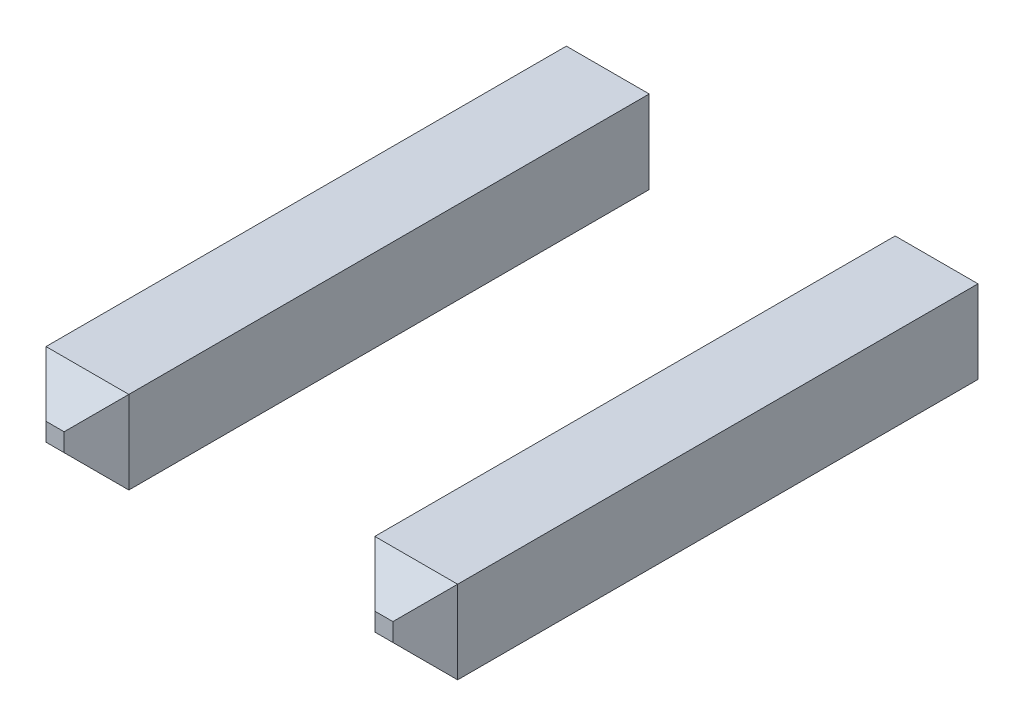
ISO-10303-21;
HEADER;
FILE_DESCRIPTION(('STEP AP214'),'2;1');
FILE_NAME('part.step','',(''),(''),'','','');
FILE_SCHEMA(('AUTOMOTIVE_DESIGN { 1 0 10303 214 1 1 1 1 }'));
ENDSEC;
DATA;
#1=APPLICATION_CONTEXT('core data for automotive mechanical design processes');
#2=APPLICATION_PROTOCOL_DEFINITION('international standard','automotive_design',2000,#1);
#3=PRODUCT_CONTEXT('',#1,'mechanical');
#4=PRODUCT('Part','Part','',(#3));
#5=PRODUCT_RELATED_PRODUCT_CATEGORY('part','',(#4));
#6=PRODUCT_DEFINITION_FORMATION('','',#4);
#7=PRODUCT_DEFINITION_CONTEXT('part definition',#1,'design');
#8=PRODUCT_DEFINITION('design','',#6,#7);
#9=PRODUCT_DEFINITION_SHAPE('','',#8);
#10=(LENGTH_UNIT() NAMED_UNIT(*) SI_UNIT(.MILLI.,.METRE.));
#11=(NAMED_UNIT(*) PLANE_ANGLE_UNIT() SI_UNIT($,.RADIAN.));
#12=(NAMED_UNIT(*) SI_UNIT($,.STERADIAN.) SOLID_ANGLE_UNIT());
#13=UNCERTAINTY_MEASURE_WITH_UNIT(LENGTH_MEASURE(1.E-05),#10,'distance_accuracy_value','');
#14=(GEOMETRIC_REPRESENTATION_CONTEXT(3) GLOBAL_UNCERTAINTY_ASSIGNED_CONTEXT((#13)) GLOBAL_UNIT_ASSIGNED_CONTEXT((#10,
#11,#12)) REPRESENTATION_CONTEXT('',''));
#15=CARTESIAN_POINT('',(0.,0.,0.));
#16=DIRECTION('',(0.,0.,1.));
#17=DIRECTION('',(1.,0.,0.));
#18=AXIS2_PLACEMENT_3D('',#15,#16,#17);
#19=CARTESIAN_POINT('',(0.32,0.32,-3.683));
#20=DIRECTION('',(1.,0.,0.));
#21=DIRECTION('',(0.,1.,0.));
#22=AXIS2_PLACEMENT_3D('',#19,#20,#21);
#23=PLANE('',#22);
#24=DIRECTION('',(0.,-1.,0.));
#25=VECTOR('',#24,1.);
#26=CARTESIAN_POINT('',(0.32,0.32,4.239));
#27=LINE('',#26,#25);
#28=CARTESIAN_POINT('',(0.32,0.32,4.239));
#29=VERTEX_POINT('',#28);
#30=CARTESIAN_POINT('',(0.32,-0.32,4.239));
#31=VERTEX_POINT('',#30);
#32=EDGE_CURVE('P0_E41',#29,#31,#27,.T.);
#33=ORIENTED_EDGE('',*,*,#32,.F.);
#34=DIRECTION('',(0.,0.,1.));
#35=VECTOR('',#34,1.);
#36=CARTESIAN_POINT('',(0.32,0.32,-3.683));
#37=LINE('',#36,#35);
#38=CARTESIAN_POINT('',(0.32,0.32,8.259));
#39=VERTEX_POINT('',#38);
#40=EDGE_CURVE('P0_E11',#29,#39,#37,.T.);
#41=ORIENTED_EDGE('',*,*,#40,.T.);
#42=DIRECTION('',(0.,-1.,0.));
#43=VECTOR('',#42,1.);
#44=CARTESIAN_POINT('',(0.32,0.32,8.259));
#45=LINE('',#44,#43);
#46=CARTESIAN_POINT('',(0.32,-0.32,8.259));
#47=VERTEX_POINT('',#46);
#48=EDGE_CURVE('P0_E27',#39,#47,#45,.T.);
#49=ORIENTED_EDGE('',*,*,#48,.T.);
#50=DIRECTION('',(0.,0.,1.));
#51=VECTOR('',#50,1.);
#52=CARTESIAN_POINT('',(0.32,-0.32,-3.683));
#53=LINE('',#52,#51);
#54=EDGE_CURVE('P0_E111',#31,#47,#53,.T.);
#55=ORIENTED_EDGE('',*,*,#54,.F.);
#56=EDGE_LOOP('',(#33,#41,#49,#55));
#57=FACE_BOUND('',#56,.T.);
#58=ADVANCED_FACE('P0_F16',(#57),#23,.T.);
#59=CARTESIAN_POINT('',(-0.32,-0.32,-3.683));
#60=DIRECTION('',(0.,-1.,0.));
#61=DIRECTION('',(0.,0.,-1.));
#62=AXIS2_PLACEMENT_3D('',#59,#60,#61);
#63=PLANE('',#62);
#64=DIRECTION('',(-1.,0.,0.));
#65=VECTOR('',#64,1.);
#66=CARTESIAN_POINT('',(-0.933161319874351,-0.32,4.239));
#67=LINE('',#66,#65);
#68=CARTESIAN_POINT('',(-0.32,-0.32,4.239));
#69=VERTEX_POINT('',#68);
#70=EDGE_CURVE('P0_E77',#31,#69,#67,.T.);
#71=ORIENTED_EDGE('',*,*,#70,.F.);
#72=ORIENTED_EDGE('',*,*,#54,.T.);
#73=DIRECTION('',(-1.,0.,0.));
#74=VECTOR('',#73,1.);
#75=CARTESIAN_POINT('',(-0.32,-0.32,8.259));
#76=LINE('',#75,#74);
#77=CARTESIAN_POINT('',(-0.32,-0.32,8.259));
#78=VERTEX_POINT('',#77);
#79=EDGE_CURVE('P0_E91',#47,#78,#76,.T.);
#80=ORIENTED_EDGE('',*,*,#79,.T.);
#81=DIRECTION('',(0.,0.,1.));
#82=VECTOR('',#81,1.);
#83=CARTESIAN_POINT('',(-0.32,-0.32,-3.683));
#84=LINE('',#83,#82);
#85=EDGE_CURVE('P0_E90',#69,#78,#84,.T.);
#86=ORIENTED_EDGE('',*,*,#85,.F.);
#87=EDGE_LOOP('',(#71,#72,#80,#86));
#88=FACE_BOUND('',#87,.T.);
#89=ADVANCED_FACE('P0_F18',(#88),#63,.T.);
#90=CARTESIAN_POINT('',(-0.32,0.32,-3.683));
#91=DIRECTION('',(-1.,0.,0.));
#92=DIRECTION('',(0.,0.,1.));
#93=AXIS2_PLACEMENT_3D('',#90,#91,#92);
#94=PLANE('',#93);
#95=DIRECTION('',(0.,1.,0.));
#96=VECTOR('',#95,1.);
#97=CARTESIAN_POINT('',(-0.32,0.32,4.239));
#98=LINE('',#97,#96);
#99=CARTESIAN_POINT('',(-0.32,0.32,4.239));
#100=VERTEX_POINT('',#99);
#101=EDGE_CURVE('P0_E82',#69,#100,#98,.T.);
#102=ORIENTED_EDGE('',*,*,#101,.F.);
#103=ORIENTED_EDGE('',*,*,#85,.T.);
#104=DIRECTION('',(0.,1.,0.));
#105=VECTOR('',#104,1.);
#106=CARTESIAN_POINT('',(-0.32,0.32,8.259));
#107=LINE('',#106,#105);
#108=CARTESIAN_POINT('',(-0.32,0.32,8.259));
#109=VERTEX_POINT('',#108);
#110=EDGE_CURVE('P0_E96',#78,#109,#107,.T.);
#111=ORIENTED_EDGE('',*,*,#110,.T.);
#112=DIRECTION('',(0.,0.,1.));
#113=VECTOR('',#112,1.);
#114=CARTESIAN_POINT('',(-0.32,0.32,-3.683));
#115=LINE('',#114,#113);
#116=EDGE_CURVE('P0_E100',#100,#109,#115,.T.);
#117=ORIENTED_EDGE('',*,*,#116,.F.);
#118=EDGE_LOOP('',(#102,#103,#111,#117));
#119=FACE_BOUND('',#118,.T.);
#120=ADVANCED_FACE('P0_F98',(#119),#94,.T.);
#121=CARTESIAN_POINT('',(-0.32,0.32,-3.683));
#122=DIRECTION('',(0.,1.,0.));
#123=DIRECTION('',(1.,0.,0.));
#124=AXIS2_PLACEMENT_3D('',#121,#122,#123);
#125=PLANE('',#124);
#126=DIRECTION('',(-1.,0.,0.));
#127=VECTOR('',#126,1.);
#128=CARTESIAN_POINT('',(-0.933161319874351,0.32,4.239));
#129=LINE('',#128,#127);
#130=EDGE_CURVE('P0_E133',#29,#100,#129,.T.);
#131=ORIENTED_EDGE('',*,*,#130,.T.);
#132=ORIENTED_EDGE('',*,*,#116,.T.);
#133=DIRECTION('',(1.,0.,0.));
#134=VECTOR('',#133,1.);
#135=CARTESIAN_POINT('',(-0.32,0.32,8.259));
#136=LINE('',#135,#134);
#137=EDGE_CURVE('P0_E132',#109,#39,#136,.T.);
#138=ORIENTED_EDGE('',*,*,#137,.T.);
#139=ORIENTED_EDGE('',*,*,#40,.F.);
#140=EDGE_LOOP('',(#131,#132,#138,#139));
#141=FACE_BOUND('',#140,.T.);
#142=ADVANCED_FACE('P0_F235',(#141),#125,.T.);
#143=CARTESIAN_POINT('',(0.,0.,8.509));
#144=DIRECTION('',(0.,0.,1.));
#145=DIRECTION('',(1.,0.,0.));
#146=AXIS2_PLACEMENT_3D('',#143,#144,#145);
#147=PLANE('',#146);
#148=DIRECTION('',(0.,-1.,0.));
#149=VECTOR('',#148,1.);
#150=CARTESIAN_POINT('',(-0.07,0.,8.509));
#151=LINE('',#150,#149);
#152=CARTESIAN_POINT('',(-0.07,0.07,8.509));
#153=VERTEX_POINT('',#152);
#154=CARTESIAN_POINT('',(-0.07,-0.07,8.509));
#155=VERTEX_POINT('',#154);
#156=EDGE_CURVE('P0_E128',#153,#155,#151,.T.);
#157=ORIENTED_EDGE('',*,*,#156,.T.);
#158=DIRECTION('',(1.,0.,0.));
#159=VECTOR('',#158,1.);
#160=CARTESIAN_POINT('',(0.,-0.07,8.509));
#161=LINE('',#160,#159);
#162=CARTESIAN_POINT('',(0.07,-0.07,8.509));
#163=VERTEX_POINT('',#162);
#164=EDGE_CURVE('P0_E116',#155,#163,#161,.T.);
#165=ORIENTED_EDGE('',*,*,#164,.T.);
#166=DIRECTION('',(0.,1.,0.));
#167=VECTOR('',#166,1.);
#168=CARTESIAN_POINT('',(0.07,0.,8.509));
#169=LINE('',#168,#167);
#170=CARTESIAN_POINT('',(0.07,0.07,8.509));
#171=VERTEX_POINT('',#170);
#172=EDGE_CURVE('P0_E113',#163,#171,#169,.T.);
#173=ORIENTED_EDGE('',*,*,#172,.T.);
#174=DIRECTION('',(-1.,0.,0.));
#175=VECTOR('',#174,1.);
#176=CARTESIAN_POINT('',(0.,0.07,8.509));
#177=LINE('',#176,#175);
#178=EDGE_CURVE('P0_E117',#171,#153,#177,.T.);
#179=ORIENTED_EDGE('',*,*,#178,.T.);
#180=EDGE_LOOP('',(#157,#165,#173,#179));
#181=FACE_BOUND('',#180,.T.);
#182=ADVANCED_FACE('P0_F148',(#181),#147,.T.);
#183=CARTESIAN_POINT('',(0.,0.07,8.509));
#184=DIRECTION('',(0.,-0.70710678118655,-0.707106781186545));
#185=DIRECTION('',(0.,0.707106781186545,-0.70710678118655));
#186=AXIS2_PLACEMENT_3D('',#183,#184,#185);
#187=PLANE('',#186);
#188=DIRECTION('',(-0.577350269189625,-0.577350269189625,0.577350269189629));
#189=VECTOR('',#188,1.);
#190=CARTESIAN_POINT('',(0.0466666666666667,0.0466666666666666,8.53233333333333));
#191=LINE('',#190,#189);
#192=EDGE_CURVE('P0_E119',#39,#171,#191,.T.);
#193=ORIENTED_EDGE('',*,*,#192,.F.);
#194=ORIENTED_EDGE('',*,*,#137,.F.);
#195=DIRECTION('',(-0.577350269189625,0.577350269189625,-0.577350269189629));
#196=VECTOR('',#195,1.);
#197=CARTESIAN_POINT('',(-0.0466666666666666,0.0466666666666666,8.53233333333333));
#198=LINE('',#197,#196);
#199=EDGE_CURVE('P0_E20',#153,#109,#198,.T.);
#200=ORIENTED_EDGE('',*,*,#199,.F.);
#201=ORIENTED_EDGE('',*,*,#178,.F.);
#202=EDGE_LOOP('',(#193,#194,#200,#201));
#203=FACE_BOUND('',#202,.T.);
#204=ADVANCED_FACE('P0_F162',(#203),#187,.F.);
#205=CARTESIAN_POINT('',(-0.07,0.,8.509));
#206=DIRECTION('',(0.70710678118655,0.,-0.707106781186545));
#207=DIRECTION('',(0.,-1.,0.));
#208=AXIS2_PLACEMENT_3D('',#205,#206,#207);
#209=PLANE('',#208);
#210=ORIENTED_EDGE('',*,*,#199,.T.);
#211=ORIENTED_EDGE('',*,*,#110,.F.);
#212=DIRECTION('',(-0.577350269189625,-0.577350269189625,-0.577350269189629));
#213=VECTOR('',#212,1.);
#214=CARTESIAN_POINT('',(-0.0466666666666666,-0.0466666666666667,8.53233333333333));
#215=LINE('',#214,#213);
#216=EDGE_CURVE('P0_E123',#155,#78,#215,.T.);
#217=ORIENTED_EDGE('',*,*,#216,.F.);
#218=ORIENTED_EDGE('',*,*,#156,.F.);
#219=EDGE_LOOP('',(#210,#211,#217,#218));
#220=FACE_BOUND('',#219,.T.);
#221=ADVANCED_FACE('P0_F243',(#220),#209,.F.);
#222=CARTESIAN_POINT('',(0.07,0.,8.509));
#223=DIRECTION('',(-0.70710678118655,0.,-0.707106781186545));
#224=DIRECTION('',(-0.707106781186545,0.,0.70710678118655));
#225=AXIS2_PLACEMENT_3D('',#222,#223,#224);
#226=PLANE('',#225);
#227=ORIENTED_EDGE('',*,*,#192,.T.);
#228=ORIENTED_EDGE('',*,*,#172,.F.);
#229=DIRECTION('',(-0.577350269189625,0.577350269189625,0.577350269189629));
#230=VECTOR('',#229,1.);
#231=CARTESIAN_POINT('',(0.0466666666666667,-0.0466666666666667,8.53233333333333));
#232=LINE('',#231,#230);
#233=EDGE_CURVE('P0_E124',#47,#163,#232,.T.);
#234=ORIENTED_EDGE('',*,*,#233,.F.);
#235=ORIENTED_EDGE('',*,*,#48,.F.);
#236=EDGE_LOOP('',(#227,#228,#234,#235));
#237=FACE_BOUND('',#236,.T.);
#238=ADVANCED_FACE('P0_F158',(#237),#226,.F.);
#239=CARTESIAN_POINT('',(0.,-0.07,8.509));
#240=DIRECTION('',(0.,0.70710678118655,-0.707106781186545));
#241=DIRECTION('',(-1.,0.,0.));
#242=AXIS2_PLACEMENT_3D('',#239,#240,#241);
#243=PLANE('',#242);
#244=ORIENTED_EDGE('',*,*,#216,.T.);
#245=ORIENTED_EDGE('',*,*,#79,.F.);
#246=ORIENTED_EDGE('',*,*,#233,.T.);
#247=ORIENTED_EDGE('',*,*,#164,.F.);
#248=EDGE_LOOP('',(#244,#245,#246,#247));
#249=FACE_BOUND('',#248,.T.);
#250=ADVANCED_FACE('P0_F155',(#249),#243,.F.);
#251=CARTESIAN_POINT('',(-0.933161319874351,0.32,4.239));
#252=DIRECTION('',(0.,0.,1.));
#253=DIRECTION('',(1.,0.,0.));
#254=AXIS2_PLACEMENT_3D('',#251,#252,#253);
#255=PLANE('',#254);
#256=ORIENTED_EDGE('',*,*,#32,.T.);
#257=ORIENTED_EDGE('',*,*,#70,.T.);
#258=ORIENTED_EDGE('',*,*,#101,.T.);
#259=ORIENTED_EDGE('',*,*,#130,.F.);
#260=EDGE_LOOP('',(#256,#257,#258,#259));
#261=FACE_BOUND('',#260,.T.);
#262=ADVANCED_FACE('P0_F79',(#261),#255,.F.);
#263=CLOSED_SHELL('',(#58,#89,#120,#142,#182,#204,#221,#238,#250,#262));
#264=MANIFOLD_SOLID_BREP('P0_B1',#263);
#265=CARTESIAN_POINT('',(2.54,0.,8.509));
#266=DIRECTION('',(0.,0.,1.));
#267=DIRECTION('',(1.,0.,0.));
#268=AXIS2_PLACEMENT_3D('',#265,#266,#267);
#269=PLANE('',#268);
#270=DIRECTION('',(0.,-1.,0.));
#271=VECTOR('',#270,1.);
#272=CARTESIAN_POINT('',(2.47,0.,8.509));
#273=LINE('',#272,#271);
#274=CARTESIAN_POINT('',(2.47,0.07,8.509));
#275=VERTEX_POINT('',#274);
#276=CARTESIAN_POINT('',(2.47,-0.07,8.509));
#277=VERTEX_POINT('',#276);
#278=EDGE_CURVE('P1_E11',#275,#277,#273,.T.);
#279=ORIENTED_EDGE('',*,*,#278,.T.);
#280=DIRECTION('',(1.,0.,0.));
#281=VECTOR('',#280,1.);
#282=CARTESIAN_POINT('',(2.54,-0.07,8.509));
#283=LINE('',#282,#281);
#284=CARTESIAN_POINT('',(2.61,-0.07,8.509));
#285=VERTEX_POINT('',#284);
#286=EDGE_CURVE('P1_E25',#277,#285,#283,.T.);
#287=ORIENTED_EDGE('',*,*,#286,.T.);
#288=DIRECTION('',(0.,1.,0.));
#289=VECTOR('',#288,1.);
#290=CARTESIAN_POINT('',(2.61,0.,8.509));
#291=LINE('',#290,#289);
#292=CARTESIAN_POINT('',(2.61,0.07,8.509));
#293=VERTEX_POINT('',#292);
#294=EDGE_CURVE('P1_E50',#285,#293,#291,.T.);
#295=ORIENTED_EDGE('',*,*,#294,.T.);
#296=DIRECTION('',(-1.,0.,0.));
#297=VECTOR('',#296,1.);
#298=CARTESIAN_POINT('',(2.54,0.07,8.509));
#299=LINE('',#298,#297);
#300=EDGE_CURVE('P1_E90',#293,#275,#299,.T.);
#301=ORIENTED_EDGE('',*,*,#300,.T.);
#302=EDGE_LOOP('',(#279,#287,#295,#301));
#303=FACE_BOUND('',#302,.T.);
#304=ADVANCED_FACE('P1_F16',(#303),#269,.T.);
#305=CARTESIAN_POINT('',(2.61,0.,8.509));
#306=DIRECTION('',(-0.70710678118655,0.,-0.707106781186545));
#307=DIRECTION('',(-0.707106781186545,0.,0.70710678118655));
#308=AXIS2_PLACEMENT_3D('',#305,#306,#307);
#309=PLANE('',#308);
#310=DIRECTION('',(-0.577350269189625,-0.577350269189625,0.577350269189629));
#311=VECTOR('',#310,1.);
#312=CARTESIAN_POINT('',(2.58666666666667,0.0466666666666666,8.53233333333333));
#313=LINE('',#312,#311);
#314=CARTESIAN_POINT('',(2.86,0.32,8.259));
#315=VERTEX_POINT('',#314);
#316=EDGE_CURVE('P1_E97',#315,#293,#313,.T.);
#317=ORIENTED_EDGE('',*,*,#316,.T.);
#318=ORIENTED_EDGE('',*,*,#294,.F.);
#319=DIRECTION('',(-0.577350269189625,0.577350269189625,0.577350269189629));
#320=VECTOR('',#319,1.);
#321=CARTESIAN_POINT('',(2.58666666666667,-0.0466666666666667,8.53233333333333));
#322=LINE('',#321,#320);
#323=CARTESIAN_POINT('',(2.86,-0.32,8.259));
#324=VERTEX_POINT('',#323);
#325=EDGE_CURVE('P1_E111',#324,#285,#322,.T.);
#326=ORIENTED_EDGE('',*,*,#325,.F.);
#327=DIRECTION('',(0.,-1.,0.));
#328=VECTOR('',#327,1.);
#329=CARTESIAN_POINT('',(2.86,0.32,8.259));
#330=LINE('',#329,#328);
#331=EDGE_CURVE('P1_E153',#315,#324,#330,.T.);
#332=ORIENTED_EDGE('',*,*,#331,.F.);
#333=EDGE_LOOP('',(#317,#318,#326,#332));
#334=FACE_BOUND('',#333,.T.);
#335=ADVANCED_FACE('P1_F18',(#334),#309,.F.);
#336=CARTESIAN_POINT('',(2.54,-0.07,8.509));
#337=DIRECTION('',(0.,0.70710678118655,-0.707106781186545));
#338=DIRECTION('',(-1.,0.,0.));
#339=AXIS2_PLACEMENT_3D('',#336,#337,#338);
#340=PLANE('',#339);
#341=DIRECTION('',(-0.577350269189625,-0.577350269189625,-0.577350269189629));
#342=VECTOR('',#341,1.);
#343=CARTESIAN_POINT('',(2.49333333333333,-0.0466666666666667,8.53233333333333));
#344=LINE('',#343,#342);
#345=CARTESIAN_POINT('',(2.22,-0.32,8.259));
#346=VERTEX_POINT('',#345);
#347=EDGE_CURVE('P1_E105',#277,#346,#344,.T.);
#348=ORIENTED_EDGE('',*,*,#347,.T.);
#349=DIRECTION('',(-1.,0.,0.));
#350=VECTOR('',#349,1.);
#351=CARTESIAN_POINT('',(2.22,-0.32,8.259));
#352=LINE('',#351,#350);
#353=EDGE_CURVE('P1_E136',#324,#346,#352,.T.);
#354=ORIENTED_EDGE('',*,*,#353,.F.);
#355=ORIENTED_EDGE('',*,*,#325,.T.);
#356=ORIENTED_EDGE('',*,*,#286,.F.);
#357=EDGE_LOOP('',(#348,#354,#355,#356));
#358=FACE_BOUND('',#357,.T.);
#359=ADVANCED_FACE('P1_F170',(#358),#340,.F.);
#360=CARTESIAN_POINT('',(2.47,0.,8.509));
#361=DIRECTION('',(0.70710678118655,0.,-0.707106781186545));
#362=DIRECTION('',(0.,-1.,0.));
#363=AXIS2_PLACEMENT_3D('',#360,#361,#362);
#364=PLANE('',#363);
#365=DIRECTION('',(-0.577350269189625,0.577350269189625,-0.577350269189629));
#366=VECTOR('',#365,1.);
#367=CARTESIAN_POINT('',(2.49333333333333,0.0466666666666666,8.53233333333333));
#368=LINE('',#367,#366);
#369=CARTESIAN_POINT('',(2.22,0.32,8.259));
#370=VERTEX_POINT('',#369);
#371=EDGE_CURVE('P1_E103',#275,#370,#368,.T.);
#372=ORIENTED_EDGE('',*,*,#371,.T.);
#373=DIRECTION('',(0.,1.,0.));
#374=VECTOR('',#373,1.);
#375=CARTESIAN_POINT('',(2.22,0.32,8.259));
#376=LINE('',#375,#374);
#377=EDGE_CURVE('P1_E134',#346,#370,#376,.T.);
#378=ORIENTED_EDGE('',*,*,#377,.F.);
#379=ORIENTED_EDGE('',*,*,#347,.F.);
#380=ORIENTED_EDGE('',*,*,#278,.F.);
#381=EDGE_LOOP('',(#372,#378,#379,#380));
#382=FACE_BOUND('',#381,.T.);
#383=ADVANCED_FACE('P1_F101',(#382),#364,.F.);
#384=CARTESIAN_POINT('',(2.54,0.07,8.509));
#385=DIRECTION('',(0.,-0.70710678118655,-0.707106781186545));
#386=DIRECTION('',(0.,0.707106781186545,-0.70710678118655));
#387=AXIS2_PLACEMENT_3D('',#384,#385,#386);
#388=PLANE('',#387);
#389=ORIENTED_EDGE('',*,*,#316,.F.);
#390=DIRECTION('',(1.,0.,0.));
#391=VECTOR('',#390,1.);
#392=CARTESIAN_POINT('',(2.22,0.32,8.259));
#393=LINE('',#392,#391);
#394=EDGE_CURVE('P1_E109',#370,#315,#393,.T.);
#395=ORIENTED_EDGE('',*,*,#394,.F.);
#396=ORIENTED_EDGE('',*,*,#371,.F.);
#397=ORIENTED_EDGE('',*,*,#300,.F.);
#398=EDGE_LOOP('',(#389,#395,#396,#397));
#399=FACE_BOUND('',#398,.T.);
#400=ADVANCED_FACE('P1_F107',(#399),#388,.F.);
#401=CARTESIAN_POINT('',(2.22,0.32,-3.683));
#402=DIRECTION('',(0.,1.,0.));
#403=DIRECTION('',(1.,0.,0.));
#404=AXIS2_PLACEMENT_3D('',#401,#402,#403);
#405=PLANE('',#404);
#406=DIRECTION('',(-1.,0.,0.));
#407=VECTOR('',#406,1.);
#408=CARTESIAN_POINT('',(-0.933161319874351,0.32,4.239));
#409=LINE('',#408,#407);
#410=CARTESIAN_POINT('',(2.86,0.32,4.239));
#411=VERTEX_POINT('',#410);
#412=CARTESIAN_POINT('',(2.22,0.32,4.239));
#413=VERTEX_POINT('',#412);
#414=EDGE_CURVE('P1_E112',#411,#413,#409,.T.);
#415=ORIENTED_EDGE('',*,*,#414,.T.);
#416=DIRECTION('',(0.,0.,1.));
#417=VECTOR('',#416,1.);
#418=CARTESIAN_POINT('',(2.22,0.32,-3.683));
#419=LINE('',#418,#417);
#420=EDGE_CURVE('P1_E122',#413,#370,#419,.T.);
#421=ORIENTED_EDGE('',*,*,#420,.T.);
#422=ORIENTED_EDGE('',*,*,#394,.T.);
#423=DIRECTION('',(0.,0.,1.));
#424=VECTOR('',#423,1.);
#425=CARTESIAN_POINT('',(2.86,0.32,-3.683));
#426=LINE('',#425,#424);
#427=EDGE_CURVE('P1_E139',#411,#315,#426,.T.);
#428=ORIENTED_EDGE('',*,*,#427,.F.);
#429=EDGE_LOOP('',(#415,#421,#422,#428));
#430=FACE_BOUND('',#429,.T.);
#431=ADVANCED_FACE('P1_F163',(#430),#405,.T.);
#432=CARTESIAN_POINT('',(2.22,0.32,-3.683));
#433=DIRECTION('',(-1.,0.,0.));
#434=DIRECTION('',(0.,0.,1.));
#435=AXIS2_PLACEMENT_3D('',#432,#433,#434);
#436=PLANE('',#435);
#437=DIRECTION('',(0.,1.,0.));
#438=VECTOR('',#437,1.);
#439=CARTESIAN_POINT('',(2.22,0.32,4.239));
#440=LINE('',#439,#438);
#441=CARTESIAN_POINT('',(2.22,-0.32,4.239));
#442=VERTEX_POINT('',#441);
#443=EDGE_CURVE('P1_E126',#442,#413,#440,.T.);
#444=ORIENTED_EDGE('',*,*,#443,.F.);
#445=DIRECTION('',(0.,0.,1.));
#446=VECTOR('',#445,1.);
#447=CARTESIAN_POINT('',(2.22,-0.32,-3.683));
#448=LINE('',#447,#446);
#449=EDGE_CURVE('P1_E129',#442,#346,#448,.T.);
#450=ORIENTED_EDGE('',*,*,#449,.T.);
#451=ORIENTED_EDGE('',*,*,#377,.T.);
#452=ORIENTED_EDGE('',*,*,#420,.F.);
#453=EDGE_LOOP('',(#444,#450,#451,#452));
#454=FACE_BOUND('',#453,.T.);
#455=ADVANCED_FACE('P1_F167',(#454),#436,.T.);
#456=CARTESIAN_POINT('',(2.22,-0.32,-3.683));
#457=DIRECTION('',(0.,-1.,0.));
#458=DIRECTION('',(0.,0.,-1.));
#459=AXIS2_PLACEMENT_3D('',#456,#457,#458);
#460=PLANE('',#459);
#461=DIRECTION('',(-1.,0.,0.));
#462=VECTOR('',#461,1.);
#463=CARTESIAN_POINT('',(-0.933161319874351,-0.32,4.239));
#464=LINE('',#463,#462);
#465=CARTESIAN_POINT('',(2.86,-0.32,4.239));
#466=VERTEX_POINT('',#465);
#467=EDGE_CURVE('P1_E141',#466,#442,#464,.T.);
#468=ORIENTED_EDGE('',*,*,#467,.F.);
#469=DIRECTION('',(0.,0.,1.));
#470=VECTOR('',#469,1.);
#471=CARTESIAN_POINT('',(2.86,-0.32,-3.683));
#472=LINE('',#471,#470);
#473=EDGE_CURVE('P1_E138',#466,#324,#472,.T.);
#474=ORIENTED_EDGE('',*,*,#473,.T.);
#475=ORIENTED_EDGE('',*,*,#353,.T.);
#476=ORIENTED_EDGE('',*,*,#449,.F.);
#477=EDGE_LOOP('',(#468,#474,#475,#476));
#478=FACE_BOUND('',#477,.T.);
#479=ADVANCED_FACE('P1_F173',(#478),#460,.T.);
#480=CARTESIAN_POINT('',(2.86,0.32,-3.683));
#481=DIRECTION('',(1.,0.,0.));
#482=DIRECTION('',(0.,1.,0.));
#483=AXIS2_PLACEMENT_3D('',#480,#481,#482);
#484=PLANE('',#483);
#485=DIRECTION('',(0.,-1.,0.));
#486=VECTOR('',#485,1.);
#487=CARTESIAN_POINT('',(2.86,0.32,4.239));
#488=LINE('',#487,#486);
#489=EDGE_CURVE('P1_E145',#411,#466,#488,.T.);
#490=ORIENTED_EDGE('',*,*,#489,.F.);
#491=ORIENTED_EDGE('',*,*,#427,.T.);
#492=ORIENTED_EDGE('',*,*,#331,.T.);
#493=ORIENTED_EDGE('',*,*,#473,.F.);
#494=EDGE_LOOP('',(#490,#491,#492,#493));
#495=FACE_BOUND('',#494,.T.);
#496=ADVANCED_FACE('P1_F177',(#495),#484,.T.);
#497=CARTESIAN_POINT('',(-0.933161319874351,0.32,4.239));
#498=DIRECTION('',(0.,0.,1.));
#499=DIRECTION('',(1.,0.,0.));
#500=AXIS2_PLACEMENT_3D('',#497,#498,#499);
#501=PLANE('',#500);
#502=ORIENTED_EDGE('',*,*,#443,.T.);
#503=ORIENTED_EDGE('',*,*,#414,.F.);
#504=ORIENTED_EDGE('',*,*,#489,.T.);
#505=ORIENTED_EDGE('',*,*,#467,.T.);
#506=EDGE_LOOP('',(#502,#503,#504,#505));
#507=FACE_BOUND('',#506,.T.);
#508=ADVANCED_FACE('P1_F180',(#507),#501,.F.);
#509=CLOSED_SHELL('',(#304,#335,#359,#383,#400,#431,#455,#479,#496,#508));
#510=MANIFOLD_SOLID_BREP('P1_B1',#509);
#511=ADVANCED_BREP_SHAPE_REPRESENTATION('',(#18,#264,#510),#14);
#512=SHAPE_DEFINITION_REPRESENTATION(#9,#511);
ENDSEC;
END-ISO-10303-21;
